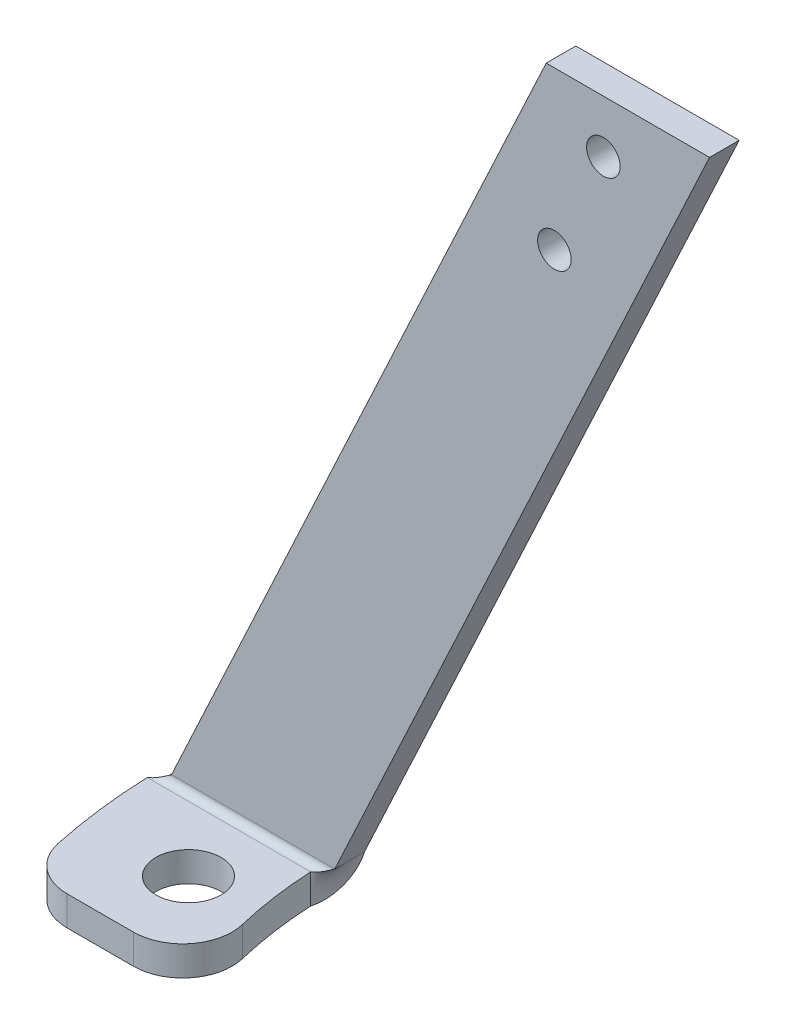
ISO-10303-21;
HEADER;
FILE_DESCRIPTION(('STEP AP214'),'2;1');
FILE_NAME('part.step','',(''),(''),'','','');
FILE_SCHEMA(('AUTOMOTIVE_DESIGN { 1 0 10303 214 1 1 1 1 }'));
ENDSEC;
DATA;
#1=APPLICATION_CONTEXT('core data for automotive mechanical design processes');
#2=APPLICATION_PROTOCOL_DEFINITION('international standard','automotive_design',2000,#1);
#3=PRODUCT_CONTEXT('',#1,'mechanical');
#4=PRODUCT('Part','Part','',(#3));
#5=PRODUCT_RELATED_PRODUCT_CATEGORY('part','',(#4));
#6=PRODUCT_DEFINITION_FORMATION('','',#4);
#7=PRODUCT_DEFINITION_CONTEXT('part definition',#1,'design');
#8=PRODUCT_DEFINITION('design','',#6,#7);
#9=PRODUCT_DEFINITION_SHAPE('','',#8);
#10=(LENGTH_UNIT() NAMED_UNIT(*) SI_UNIT(.MILLI.,.METRE.));
#11=(NAMED_UNIT(*) PLANE_ANGLE_UNIT() SI_UNIT($,.RADIAN.));
#12=(NAMED_UNIT(*) SI_UNIT($,.STERADIAN.) SOLID_ANGLE_UNIT());
#13=UNCERTAINTY_MEASURE_WITH_UNIT(LENGTH_MEASURE(1.E-05),#10,'distance_accuracy_value','');
#14=(GEOMETRIC_REPRESENTATION_CONTEXT(3) GLOBAL_UNCERTAINTY_ASSIGNED_CONTEXT((#13)) GLOBAL_UNIT_ASSIGNED_CONTEXT((#10,
#11,#12)) REPRESENTATION_CONTEXT('',''));
#15=CARTESIAN_POINT('',(0.,0.,0.));
#16=DIRECTION('',(0.,0.,1.));
#17=DIRECTION('',(1.,0.,0.));
#18=AXIS2_PLACEMENT_3D('',#15,#16,#17);
#19=CARTESIAN_POINT('',(0.,0.,1.5));
#20=DIRECTION('',(0.,0.,-1.));
#21=DIRECTION('',(-1.,0.,0.));
#22=AXIS2_PLACEMENT_3D('',#19,#20,#21);
#23=PLANE('',#22);
#24=DIRECTION('',(1.,0.,0.));
#25=VECTOR('',#24,1.);
#26=CARTESIAN_POINT('',(-42.4069260201008,3.7366,1.5));
#27=LINE('',#26,#25);
#28=CARTESIAN_POINT('',(-42.4069260201008,3.7366,1.5));
#29=VERTEX_POINT('',#28);
#30=CARTESIAN_POINT('',(-58.9575948045381,3.73659999999999,1.5));
#31=VERTEX_POINT('',#30);
#32=EDGE_CURVE('E185',#29,#31,#27,.F.);
#33=ORIENTED_EDGE('',*,*,#32,.F.);
#34=DIRECTION('',(0.422618261740693,0.906307787036653,0.));
#35=VECTOR('',#34,1.);
#36=CARTESIAN_POINT('',(-44.1493312155627,0.,1.5));
#37=LINE('',#36,#35);
#38=CARTESIAN_POINT('',(-4.43317583253724,85.1715700749326,1.5));
#39=VERTEX_POINT('',#38);
#40=EDGE_CURVE('E192',#29,#39,#37,.T.);
#41=ORIENTED_EDGE('',*,*,#40,.T.);
#42=DIRECTION('',(-1.,0.,0.));
#43=VECTOR('',#42,1.);
#44=CARTESIAN_POINT('',(-20.9838446169746,85.1715700749326,1.5));
#45=LINE('',#44,#43);
#46=CARTESIAN_POINT('',(-20.9838446169746,85.1715700749326,1.5));
#47=VERTEX_POINT('',#46);
#48=EDGE_CURVE('E301',#39,#47,#45,.T.);
#49=ORIENTED_EDGE('',*,*,#48,.T.);
#50=DIRECTION('',(-0.422618261740693,-0.906307787036653,0.));
#51=VECTOR('',#50,1.);
#52=CARTESIAN_POINT('',(-60.7,0.,1.5));
#53=LINE('',#52,#51);
#54=EDGE_CURVE('E298',#47,#31,#53,.T.);
#55=ORIENTED_EDGE('',*,*,#54,.T.);
#56=EDGE_LOOP('',(#33,#41,#49,#55));
#57=FACE_BOUND('',#56,.T.);
#58=CARTESIAN_POINT('',(-15.1911080308203,79.8476218989855,1.5));
#59=DIRECTION('',(0.,0.,1.));
#60=DIRECTION('',(1.,0.,0.));
#61=AXIS2_PLACEMENT_3D('',#58,#59,#60);
#62=CIRCLE('',#61,1.69999999999999);
#63=CARTESIAN_POINT('',(-13.4911080308203,79.8476218989855,1.5));
#64=VERTEX_POINT('',#63);
#65=EDGE_CURVE('E532',#64,#64,#62,.T.);
#66=ORIENTED_EDGE('',*,*,#65,.F.);
#67=EDGE_LOOP('',(#66));
#68=FACE_BOUND('',#67,.T.);
#69=CARTESIAN_POINT('',(-20.1563036429491,69.1997255470914,1.5));
#70=DIRECTION('',(0.,0.,1.));
#71=DIRECTION('',(1.,0.,0.));
#72=AXIS2_PLACEMENT_3D('',#69,#70,#71);
#73=CIRCLE('',#72,1.69999999999999);
#74=CARTESIAN_POINT('',(-18.4563036429491,69.1997255470914,1.5));
#75=VERTEX_POINT('',#74);
#76=EDGE_CURVE('E528',#75,#75,#73,.T.);
#77=ORIENTED_EDGE('',*,*,#76,.F.);
#78=EDGE_LOOP('',(#77));
#79=FACE_BOUND('',#78,.T.);
#80=ADVANCED_FACE('F60',(#57,#68,#79),#23,.F.);
#81=CARTESIAN_POINT('',(0.,3.00000000000001,0.));
#82=DIRECTION('',(0.,-1.,0.));
#83=DIRECTION('',(0.,0.,-1.));
#84=AXIS2_PLACEMENT_3D('',#81,#82,#83);
#85=PLANE('',#84);
#86=DIRECTION('',(-1.,0.,0.));
#87=VECTOR('',#86,1.);
#88=CARTESIAN_POINT('',(-58.4336375728912,2.99999999999995,16.5));
#89=LINE('',#88,#87);
#90=CARTESIAN_POINT('',(-47.8112068707751,2.99999999999995,16.5));
#91=VERTEX_POINT('',#90);
#92=CARTESIAN_POINT('',(-54.5188471132671,2.99999999999995,16.5));
#93=VERTEX_POINT('',#92);
#94=EDGE_CURVE('E171',#91,#93,#89,.T.);
#95=ORIENTED_EDGE('',*,*,#94,.F.);
#96=CARTESIAN_POINT('',(-47.8112068707751,2.99999999999996,11.5));
#97=DIRECTION('',(0.,-1.,0.));
#98=DIRECTION('',(0.,0.,-1.));
#99=AXIS2_PLACEMENT_3D('',#96,#97,#98);
#100=CIRCLE('',#99,5.);
#101=CARTESIAN_POINT('',(-42.9498549731308,2.99999999999997,10.3307020365746));
#102=VERTEX_POINT('',#101);
#103=EDGE_CURVE('E285',#91,#102,#100,.F.);
#104=ORIENTED_EDGE('',*,*,#103,.T.);
#105=CARTESIAN_POINT('',(0.,3.00000000000001,0.));
#106=DIRECTION('',(0.,-1.,0.));
#107=DIRECTION('',(0.,0.,-1.));
#108=AXIS2_PLACEMENT_3D('',#105,#106,#107);
#109=CIRCLE('',#108,44.1748055658591);
#110=CARTESIAN_POINT('',(-44.1181489550668,3.,2.2366));
#111=VERTEX_POINT('',#110);
#112=EDGE_CURVE('E177',#111,#102,#109,.F.);
#113=ORIENTED_EDGE('',*,*,#112,.F.);
#114=DIRECTION('',(-1.,0.,0.));
#115=VECTOR('',#114,1.);
#116=CARTESIAN_POINT('',(-60.6773237745371,3.,2.2366));
#117=LINE('',#116,#115);
#118=CARTESIAN_POINT('',(-60.6773237745371,3.,2.2366));
#119=VERTEX_POINT('',#118);
#120=EDGE_CURVE('E159',#119,#111,#117,.F.);
#121=ORIENTED_EDGE('',*,*,#120,.F.);
#122=CARTESIAN_POINT('',(0.,3.00000000000001,0.));
#123=DIRECTION('',(0.,-1.,0.));
#124=DIRECTION('',(0.,0.,-1.));
#125=AXIS2_PLACEMENT_3D('',#122,#123,#124);
#126=CIRCLE('',#125,60.7185309440207);
#127=CARTESIAN_POINT('',(-59.4111913827204,2.99999999999996,12.5319726494184));
#128=VERTEX_POINT('',#127);
#129=EDGE_CURVE('E165',#128,#119,#126,.T.);
#130=ORIENTED_EDGE('',*,*,#129,.F.);
#131=CARTESIAN_POINT('',(-54.5188471132671,2.99999999999996,11.5));
#132=DIRECTION('',(0.,-1.,0.));
#133=DIRECTION('',(0.,0.,-1.));
#134=AXIS2_PLACEMENT_3D('',#131,#132,#133);
#135=CIRCLE('',#134,5.);
#136=EDGE_CURVE('E287',#128,#93,#135,.F.);
#137=ORIENTED_EDGE('',*,*,#136,.T.);
#138=EDGE_LOOP('',(#95,#104,#113,#121,#130,#137));
#139=FACE_BOUND('',#138,.T.);
#140=CARTESIAN_POINT('',(-49.9297530777189,2.99999999999997,8.80396260771343));
#141=DIRECTION('',(0.,1.,0.));
#142=DIRECTION('',(0.,0.,1.));
#143=AXIS2_PLACEMENT_3D('',#140,#141,#142);
#144=CIRCLE('',#143,3.29999999999999);
#145=CARTESIAN_POINT('',(-49.9297530777189,2.99999999999996,12.1039626077134));
#146=VERTEX_POINT('',#145);
#147=EDGE_CURVE('E541',#146,#146,#144,.T.);
#148=ORIENTED_EDGE('',*,*,#147,.F.);
#149=EDGE_LOOP('',(#148));
#150=FACE_BOUND('',#149,.T.);
#151=ADVANCED_FACE('F254',(#139,#150),#85,.F.);
#152=CARTESIAN_POINT('',(-60.7,0.,-1.5));
#153=DIRECTION('',(-0.906307787036653,0.422618261740693,0.));
#154=DIRECTION('',(-0.422618261740693,-0.906307787036653,0.));
#155=AXIS2_PLACEMENT_3D('',#152,#153,#154);
#156=PLANE('',#155);
#157=DIRECTION('',(-0.422618261740693,-0.906307787036653,0.));
#158=VECTOR('',#157,1.);
#159=CARTESIAN_POINT('',(-60.7,0.,-1.5));
#160=LINE('',#159,#158);
#161=CARTESIAN_POINT('',(-20.9838446169746,85.1715700749326,-1.5));
#162=VERTEX_POINT('',#161);
#163=CARTESIAN_POINT('',(-58.9575948045381,3.73660000000001,-1.5));
#164=VERTEX_POINT('',#163);
#165=EDGE_CURVE('E296',#162,#164,#160,.T.);
#166=ORIENTED_EDGE('',*,*,#165,.T.);
#167=DIRECTION('',(0.,0.,-1.));
#168=VECTOR('',#167,1.);
#169=CARTESIAN_POINT('',(-58.9575948045381,3.73659999999999,1.5));
#170=LINE('',#169,#168);
#171=EDGE_CURVE('E189',#31,#164,#170,.T.);
#172=ORIENTED_EDGE('',*,*,#171,.F.);
#173=ORIENTED_EDGE('',*,*,#54,.F.);
#174=DIRECTION('',(0.,0.,1.));
#175=VECTOR('',#174,1.);
#176=CARTESIAN_POINT('',(-20.9838446169746,85.1715700749326,-1.5));
#177=LINE('',#176,#175);
#178=EDGE_CURVE('E292',#162,#47,#177,.T.);
#179=ORIENTED_EDGE('',*,*,#178,.F.);
#180=EDGE_LOOP('',(#166,#172,#173,#179));
#181=FACE_BOUND('',#180,.T.);
#182=ADVANCED_FACE('F256',(#181),#156,.T.);
#183=CARTESIAN_POINT('',(-44.1493312155627,0.,-1.5));
#184=DIRECTION('',(0.906307787036653,-0.422618261740693,0.));
#185=DIRECTION('',(0.422618261740693,0.906307787036653,0.));
#186=AXIS2_PLACEMENT_3D('',#183,#184,#185);
#187=PLANE('',#186);
#188=ORIENTED_EDGE('',*,*,#40,.F.);
#189=DIRECTION('',(0.,0.,-1.));
#190=VECTOR('',#189,1.);
#191=CARTESIAN_POINT('',(-42.4069260201008,3.7366,1.5));
#192=LINE('',#191,#190);
#193=CARTESIAN_POINT('',(-42.4069260201008,3.73659999999999,-1.5));
#194=VERTEX_POINT('',#193);
#195=EDGE_CURVE('E193',#29,#194,#192,.T.);
#196=ORIENTED_EDGE('',*,*,#195,.T.);
#197=DIRECTION('',(0.422618261740693,0.906307787036653,0.));
#198=VECTOR('',#197,1.);
#199=CARTESIAN_POINT('',(-44.1493312155627,0.,-1.5));
#200=LINE('',#199,#198);
#201=CARTESIAN_POINT('',(-4.43317583253724,85.1715700749326,-1.5));
#202=VERTEX_POINT('',#201);
#203=EDGE_CURVE('E233',#194,#202,#200,.T.);
#204=ORIENTED_EDGE('',*,*,#203,.T.);
#205=DIRECTION('',(0.,0.,1.));
#206=VECTOR('',#205,1.);
#207=CARTESIAN_POINT('',(-4.43317583253724,85.1715700749326,-1.5));
#208=LINE('',#207,#206);
#209=EDGE_CURVE('E293',#202,#39,#208,.T.);
#210=ORIENTED_EDGE('',*,*,#209,.T.);
#211=EDGE_LOOP('',(#188,#196,#204,#210));
#212=FACE_BOUND('',#211,.T.);
#213=ADVANCED_FACE('F250',(#212),#187,.T.);
#214=CARTESIAN_POINT('',(0.,0.,-1.5));
#215=DIRECTION('',(0.,0.,-1.));
#216=DIRECTION('',(-1.,0.,0.));
#217=AXIS2_PLACEMENT_3D('',#214,#215,#216);
#218=PLANE('',#217);
#219=CARTESIAN_POINT('',(-20.1563036429491,69.1997255470914,-1.5));
#220=DIRECTION('',(0.,0.,-1.));
#221=DIRECTION('',(-1.,0.,0.));
#222=AXIS2_PLACEMENT_3D('',#219,#220,#221);
#223=CIRCLE('',#222,1.69999999999999);
#224=CARTESIAN_POINT('',(-21.8563036429491,69.1997255470914,-1.5));
#225=VERTEX_POINT('',#224);
#226=EDGE_CURVE('E531',#225,#225,#223,.T.);
#227=ORIENTED_EDGE('',*,*,#226,.F.);
#228=EDGE_LOOP('',(#227));
#229=FACE_BOUND('',#228,.T.);
#230=CARTESIAN_POINT('',(-15.1911080308203,79.8476218989855,-1.5));
#231=DIRECTION('',(0.,0.,-1.));
#232=DIRECTION('',(-1.,0.,0.));
#233=AXIS2_PLACEMENT_3D('',#230,#231,#232);
#234=CIRCLE('',#233,1.69999999999999);
#235=CARTESIAN_POINT('',(-16.8911080308203,79.8476218989855,-1.5));
#236=VERTEX_POINT('',#235);
#237=EDGE_CURVE('E535',#236,#236,#234,.T.);
#238=ORIENTED_EDGE('',*,*,#237,.F.);
#239=EDGE_LOOP('',(#238));
#240=FACE_BOUND('',#239,.T.);
#241=ORIENTED_EDGE('',*,*,#203,.F.);
#242=DIRECTION('',(1.,0.,0.));
#243=VECTOR('',#242,1.);
#244=CARTESIAN_POINT('',(-42.4069260201008,3.73659999999999,-1.5));
#245=LINE('',#244,#243);
#246=EDGE_CURVE('E147',#194,#164,#245,.F.);
#247=ORIENTED_EDGE('',*,*,#246,.T.);
#248=ORIENTED_EDGE('',*,*,#165,.F.);
#249=DIRECTION('',(-1.,0.,0.));
#250=VECTOR('',#249,1.);
#251=CARTESIAN_POINT('',(-20.9838446169746,85.1715700749326,-1.5));
#252=LINE('',#251,#250);
#253=EDGE_CURVE('E306',#202,#162,#252,.T.);
#254=ORIENTED_EDGE('',*,*,#253,.F.);
#255=EDGE_LOOP('',(#241,#247,#248,#254));
#256=FACE_BOUND('',#255,.T.);
#257=ADVANCED_FACE('F240',(#229,#240,#256),#218,.T.);
#258=CARTESIAN_POINT('',(-20.9838446169746,85.1715700749326,-1.5));
#259=DIRECTION('',(0.,1.,0.));
#260=DIRECTION('',(0.,0.,1.));
#261=AXIS2_PLACEMENT_3D('',#258,#259,#260);
#262=PLANE('',#261);
#263=ORIENTED_EDGE('',*,*,#48,.F.);
#264=ORIENTED_EDGE('',*,*,#209,.F.);
#265=ORIENTED_EDGE('',*,*,#253,.T.);
#266=ORIENTED_EDGE('',*,*,#178,.T.);
#267=EDGE_LOOP('',(#263,#264,#265,#266));
#268=FACE_BOUND('',#267,.T.);
#269=ADVANCED_FACE('F249',(#268),#262,.T.);
#270=CARTESIAN_POINT('',(-58.9575948045381,3.7366,-1.53));
#271=CARTESIAN_POINT('',(-59.1009295052151,3.24347124009852,-1.52999999999999));
#272=CARTESIAN_POINT('',(-59.2442162995379,2.75070041877234,-1.43196548393888));
#273=CARTESIAN_POINT('',(-59.5308377945378,1.83966874853498,-1.05460381037515));
#274=CARTESIAN_POINT('',(-59.6741485420377,1.42184832454248,-0.775425128576994));
#275=CARTESIAN_POINT('',(-59.9607700370375,0.724574871423021,-0.0781516754575178));
#276=CARTESIAN_POINT('',(-60.1040807845374,0.445396189624848,0.339668748534959));
#277=CARTESIAN_POINT('',(-60.3907022795373,0.0680345160611271,1.25070041877233));
#278=CARTESIAN_POINT('',(-60.5339890738601,-0.0300000000000078,1.74347124009848));
#279=CARTESIAN_POINT('',(-60.6773237745371,-0.0300000000000039,2.23659999999999));
#280=CARTESIAN_POINT('',(-58.9575948045381,3.7366,-1.5));
#281=CARTESIAN_POINT('',(-59.100929347774,3.24739898889228,-1.49999999999999));
#282=CARTESIAN_POINT('',(-59.2442162995379,2.75855285530311,-1.40274630363883));
#283=CARTESIAN_POINT('',(-59.5308377945378,1.8547773179461,-1.02839021872452));
#284=CARTESIAN_POINT('',(-59.6741485420377,1.44028472614173,-0.751435123305048));
#285=CARTESIAN_POINT('',(-59.9607700370375,0.748564876694966,-0.0597152738582704));
#286=CARTESIAN_POINT('',(-60.1040807845374,0.471609781275476,0.354777317946086));
#287=CARTESIAN_POINT('',(-60.3907022795373,0.0972536963611765,1.2585528553031));
#288=CARTESIAN_POINT('',(-60.5339892313012,0.,1.74739898889224));
#289=CARTESIAN_POINT('',(-60.6773237745371,0.,2.23659999999999));
#290=CARTESIAN_POINT('',(-58.9575948045381,3.7366,1.5));
#291=CARTESIAN_POINT('',(-59.1009136036655,3.64017386826869,1.5));
#292=CARTESIAN_POINT('',(-59.2442162995379,3.54379650838095,1.51917172636612));
#293=CARTESIAN_POINT('',(-59.5308377945377,3.36563425905879,1.59296894633825));
#294=CARTESIAN_POINT('',(-59.6741485420376,3.28392488606647,1.6475654038895));
#295=CARTESIAN_POINT('',(-59.9607700370375,3.1475654038895,1.78392488606648));
#296=CARTESIAN_POINT('',(-60.1040807845374,3.09296894633825,1.86563425905879));
#297=CARTESIAN_POINT('',(-60.3907022795372,3.01917172636612,2.04379650838095));
#298=CARTESIAN_POINT('',(-60.5340049754096,3.,2.14017386826869));
#299=CARTESIAN_POINT('',(-60.6773237745371,3.,2.2366));
#300=CARTESIAN_POINT('',(-58.9575948045381,3.7366,1.5303));
#301=CARTESIAN_POINT('',(-59.10091344465,3.64414089455039,1.5303));
#302=CARTESIAN_POINT('',(-59.2442162995379,3.55172746927704,1.54868309846917));
#303=CARTESIAN_POINT('',(-59.5308377945377,3.38089391416403,1.61944467390539));
#304=CARTESIAN_POINT('',(-59.6741485420376,3.30254565168171,1.67179530921417));
#305=CARTESIAN_POINT('',(-59.9607700370375,3.17179530921416,1.80254565168172));
#306=CARTESIAN_POINT('',(-60.1040807845374,3.11944467390538,1.88089391416403));
#307=CARTESIAN_POINT('',(-60.3907022795372,3.04868309846917,2.05172746927704));
#308=CARTESIAN_POINT('',(-60.5340051344251,3.0303,2.14414089455039));
#309=CARTESIAN_POINT('',(-60.6773237745371,3.0303,2.2366));
#310=B_SPLINE_SURFACE_WITH_KNOTS('',1,3,((#270,#271,#272,#273,#274,#275,#276,#277,#278,#279),
(#280,#281,#282,#283,#284,#285,#286,#287,#288,#289),(#290,#291,#292,#293,#294,#295,#296,#297,
#298,#299),(#300,#301,#302,#303,#304,#305,#306,#307,#308,#309)),.UNSPECIFIED.,.F.,.F.,.F.,(2,1,
1,2),(4,2,2,2,4),(-0.01,0.,1.,1.0101),(0.,0.25,0.5,0.75,1.),.UNSPECIFIED.);
#311=DIRECTION('',(0.,1.,0.));
#312=VECTOR('',#311,1.);
#313=CARTESIAN_POINT('',(-60.6773237745371,0.,2.23659999999999));
#314=LINE('',#313,#312);
#315=CARTESIAN_POINT('',(-60.6773237745371,0.,2.23659999999999));
#316=VERTEX_POINT('',#315);
#317=EDGE_CURVE('E181',#119,#316,#314,.F.);
#318=CARTESIAN_POINT('',(-58.9575948045381,3.7366,1.5));
#319=CARTESIAN_POINT('',(-59.009441416283,3.70171808094785,1.49998178728871));
#320=CARTESIAN_POINT('',(-59.061286182421,3.66683800927958,1.50247678780384));
#321=CARTESIAN_POINT('',(-59.1649668802592,3.59778243087087,1.51236358218766));
#322=CARTESIAN_POINT('',(-59.216802812089,3.56360681631167,1.51975462088169));
#323=CARTESIAN_POINT('',(-59.320361904387,3.49672396643255,1.53928228857175));
#324=CARTESIAN_POINT('',(-59.372085060408,3.46401364725954,1.55140837321062));
#325=CARTESIAN_POINT('',(-59.4755300108116,3.40063245124106,1.58015814888006));
#326=CARTESIAN_POINT('',(-59.5272518051819,3.3699615890546,1.59678187223394));
#327=CARTESIAN_POINT('',(-59.6344763180211,3.3091300704809,1.63556495461674));
#328=CARTESIAN_POINT('',(-59.6899792437555,3.27917033524923,1.65803997117576));
#329=CARTESIAN_POINT('',(-59.8009875457508,3.22300350112085,1.7072672408719));
#330=CARTESIAN_POINT('',(-59.8564929220309,3.1967965296728,1.73401963920911));
#331=CARTESIAN_POINT('',(-59.9674607278976,3.1487545188089,1.79116871319322));
#332=CARTESIAN_POINT('',(-60.0229231576694,3.1269161311342,1.82156256908934));
#333=CARTESIAN_POINT('',(-60.1338272787511,3.0880987908858,1.88528989298515));
#334=CARTESIAN_POINT('',(-60.189268971636,3.0711185379418,1.91862257122347));
#335=CARTESIAN_POINT('',(-60.3167995879024,3.03809612325881,1.99781439212819));
#336=CARTESIAN_POINT('',(-60.388898160156,3.02386010656592,2.044433885154));
#337=CARTESIAN_POINT('',(-60.4970228007642,3.00957214348836,2.11576553112028));
#338=CARTESIAN_POINT('',(-60.5330758900401,3.00598714649084,2.13978705328305));
#339=CARTESIAN_POINT('',(-60.6051906911462,3.00119992563898,2.18807081448111));
#340=CARTESIAN_POINT('',(-60.6412524031151,2.99999823048486,2.21233310572806));
#341=CARTESIAN_POINT('',(-60.6773237745371,3.,2.2366));
#342=B_SPLINE_CURVE_WITH_KNOTS('',3,(#318,#319,#320,#321,#322,#323,#324,#325,#326,#327,#328,
#329,#330,#331,#332,#333,#334,#335,#336,#337,#338,#339,#340,#341),.UNSPECIFIED.,.F.,.F.,(4,2,2,
2,2,2,2,2,2,2,2,4),(0.,0.187412218968422,0.374795537832105,0.561763935484441,0.748733676863889,
0.949360869451709,1.14999487398071,1.35047451032402,1.55090043424424,1.81139096513568,
1.94174776460387,2.07213347856469),.UNSPECIFIED.);
#343=EDGE_CURVE('E150',#31,#119,#342,.T.);
#344=CARTESIAN_POINT('',(-58.9575948045381,3.7366,-1.5));
#345=CARTESIAN_POINT('',(-58.9939605264405,3.61249069301924,-1.50002220762891));
#346=CARTESIAN_POINT('',(-59.0303246542398,3.48838393042922,-1.49381769923603));
#347=CARTESIAN_POINT('',(-59.1030524267076,3.24139434020056,-1.46911317433862));
#348=CARTESIAN_POINT('',(-59.139416071305,3.11851155925721,-1.45061269054855));
#349=CARTESIAN_POINT('',(-59.212064475114,2.87546050208484,-1.40152709460464));
#350=CARTESIAN_POINT('',(-59.2483492354919,2.75528694795374,-1.37096810414507));
#351=CARTESIAN_POINT('',(-59.3209170798145,2.51858169178077,-1.29807662771736));
#352=CARTESIAN_POINT('',(-59.3572001631168,2.40204941678907,-1.25574600448085));
#353=CARTESIAN_POINT('',(-59.4255707522718,2.18696025340783,-1.16528112534507));
#354=CARTESIAN_POINT('',(-59.4576588407095,2.0878817373976,-1.11838182016078));
#355=CARTESIAN_POINT('',(-59.5218443406536,1.89419058689468,-1.01604602891415));
#356=CARTESIAN_POINT('',(-59.553941751865,1.79957938864511,-0.960606821362356));
#357=CARTESIAN_POINT('',(-59.6181088620557,1.61566913530125,-0.841681053298666));
#358=CARTESIAN_POINT('',(-59.6501785621134,1.52636577481052,-0.778201149498021));
#359=CARTESIAN_POINT('',(-59.7143321236917,1.35364583526458,-0.643625454001263));
#360=CARTESIAN_POINT('',(-59.7464159862811,1.27023129762094,-0.572527042579835));
#361=CARTESIAN_POINT('',(-59.810574588333,1.10998823879921,-0.423301046436292));
#362=CARTESIAN_POINT('',(-59.8426493279332,1.03315795618362,-0.345175353206541));
#363=CARTESIAN_POINT('',(-59.9067988582251,0.886651459053779,-0.182481698646705));
#364=CARTESIAN_POINT('',(-59.9388736489169,0.816975244424482,-0.0979137374202244));
#365=CARTESIAN_POINT('',(-60.0030428142166,0.685268310163834,0.0770735314692499));
#366=CARTESIAN_POINT('',(-60.0351371868544,0.623242964925481,0.167496885051315));
#367=CARTESIAN_POINT('',(-60.0993167103744,0.507395042444284,0.353409399768144));
#368=CARTESIAN_POINT('',(-60.1314018605836,0.45356962098943,0.448896788836159));
#369=CARTESIAN_POINT('',(-60.1956009929619,0.354468311969344,0.6443131417673));
#370=CARTESIAN_POINT('',(-60.2277149760495,0.309199864652832,0.744245878436657));
#371=CARTESIAN_POINT('',(-60.2919314596654,0.227635700913525,0.947665449975193));
#372=CARTESIAN_POINT('',(-60.3240339599932,0.191336632805557,1.05115094073392));
#373=CARTESIAN_POINT('',(-60.3882002541734,0.128005057529377,1.2607925873532));
#374=CARTESIAN_POINT('',(-60.4202640515099,0.100962329931913,1.36694565781556));
#375=CARTESIAN_POINT('',(-60.4843786573045,0.0563065478405389,1.58117399672736));
#376=CARTESIAN_POINT('',(-60.5164294647105,0.0386890271258794,1.68924832963885));
#377=CARTESIAN_POINT('',(-60.5699698410693,0.0172325724939576,1.87071868064817));
#378=CARTESIAN_POINT('',(-60.5914614321266,0.0107667152048574,1.94381397636218));
#379=CARTESIAN_POINT('',(-60.6344093121025,0.00215321899631623,2.09013713409056));
#380=CARTESIAN_POINT('',(-60.655865600622,-1.54382245978864E-06,2.16336457693721));
#381=CARTESIAN_POINT('',(-60.6773237745371,0.,2.23659999999999));
#382=B_SPLINE_CURVE_WITH_KNOTS('',3,(#344,#345,#346,#347,#348,#349,#350,#351,#352,#353,#354,
#355,#356,#357,#358,#359,#360,#361,#362,#363,#364,#365,#366,#367,#368,#369,#370,#371,#372,#373,
#374,#375,#376,#377,#378,#379,#380,#381),.UNSPECIFIED.,.F.,.F.,(4,2,2,2,2,2,2,2,2,2,2,2,2,2,2,2,
2,2,4),(0.,0.387829906197559,0.775674551988107,1.1626836028898,1.54963144867197,
1.89188855545937,2.23425495898536,2.57633975527136,2.9185425617625,3.26065353358921,
3.60276449991411,3.94511443161324,4.28734534468174,4.6298724707636,4.97227140679381,
5.31429105266434,5.65614848551466,5.88542408049237,6.11432049339392),.UNSPECIFIED.);
#383=EDGE_CURVE('E188',#164,#316,#382,.T.);
#384=ORIENTED_EDGE('',*,*,#317,.F.);
#385=ORIENTED_EDGE('',*,*,#343,.F.);
#386=ORIENTED_EDGE('',*,*,#171,.T.);
#387=ORIENTED_EDGE('',*,*,#383,.T.);
#388=EDGE_LOOP('',(#384,#385,#386,#387));
#389=FACE_BOUND('',#388,.T.);
#390=ADVANCED_FACE('F207',(#389),#310,.F.);
#391=CARTESIAN_POINT('',(-44.1181489550668,-0.0299999999999991,2.23659999999999));
#392=CARTESIAN_POINT('',(-43.9755231909947,-0.0299999999999983,1.74347117642536));
#393=CARTESIAN_POINT('',(-43.8329451325724,0.0680345160611262,1.25070041877233));
#394=CARTESIAN_POINT('',(-43.5477413100781,0.445396189624855,0.339668748534967));
#395=CARTESIAN_POINT('',(-43.4051393988309,0.724574871423016,-0.0781516754575151));
#396=CARTESIAN_POINT('',(-43.1199355763366,1.42184832454248,-0.775425128576984));
#397=CARTESIAN_POINT('',(-42.9773336650894,1.83966874853497,-1.05460381037515));
#398=CARTESIAN_POINT('',(-42.6921298425951,2.75070041877233,-1.43196548393888));
#399=CARTESIAN_POINT('',(-42.5495517841728,3.24347117642536,-1.53));
#400=CARTESIAN_POINT('',(-42.4069260201007,3.73659999999999,-1.53));
#401=CARTESIAN_POINT('',(-44.1181489550668,0.,2.23659999999999));
#402=CARTESIAN_POINT('',(-43.9755233472939,0.,1.74739892548271));
#403=CARTESIAN_POINT('',(-43.8329451325724,0.0972536963611757,1.25855285530311));
#404=CARTESIAN_POINT('',(-43.5477413100781,0.471609781275483,0.354777317946094));
#405=CARTESIAN_POINT('',(-43.4051393988309,0.748564876694961,-0.0597152738582676));
#406=CARTESIAN_POINT('',(-43.1199355763366,1.44028472614173,-0.751435123305038));
#407=CARTESIAN_POINT('',(-42.9773336650894,1.85477731794609,-1.02839021872452));
#408=CARTESIAN_POINT('',(-42.6921298425951,2.75855285530311,-1.40274630363883));
#409=CARTESIAN_POINT('',(-42.5495516278736,3.24739892548272,-1.5));
#410=CARTESIAN_POINT('',(-42.4069260201007,3.73659999999999,-1.5));
#411=CARTESIAN_POINT('',(-44.1181489550668,3.,2.2366));
#412=CARTESIAN_POINT('',(-43.9755389772211,3.,2.14017383121858));
#413=CARTESIAN_POINT('',(-43.8329451325724,3.01917172636612,2.04379650838095));
#414=CARTESIAN_POINT('',(-43.5477413100781,3.09296894633825,1.86563425905879));
#415=CARTESIAN_POINT('',(-43.4051393988309,3.1475654038895,1.78392488606648));
#416=CARTESIAN_POINT('',(-43.1199355763366,3.28392488606648,1.6475654038895));
#417=CARTESIAN_POINT('',(-42.9773336650894,3.3656342590588,1.59296894633825));
#418=CARTESIAN_POINT('',(-42.6921298425951,3.54379650838095,1.51917172636612));
#419=CARTESIAN_POINT('',(-42.5495359979464,3.64017383121857,1.5));
#420=CARTESIAN_POINT('',(-42.4069260201007,3.7366,1.5));
#421=CARTESIAN_POINT('',(-44.1181489550668,3.0303,2.2366));
#422=CARTESIAN_POINT('',(-43.9755391350834,3.0303,2.14414085776651));
#423=CARTESIAN_POINT('',(-43.8329451325724,3.04868309846917,2.05172746927704));
#424=CARTESIAN_POINT('',(-43.5477413100781,3.11944467390539,1.88089391416403));
#425=CARTESIAN_POINT('',(-43.4051393988309,3.17179530921417,1.80254565168172));
#426=CARTESIAN_POINT('',(-43.1199355763366,3.30254565168172,1.67179530921417));
#427=CARTESIAN_POINT('',(-42.9773336650894,3.38089391416403,1.61944467390539));
#428=CARTESIAN_POINT('',(-42.6921298425951,3.55172746927704,1.54868309846917));
#429=CARTESIAN_POINT('',(-42.5495358400841,3.6441408577665,1.5303));
#430=CARTESIAN_POINT('',(-42.4069260201007,3.7366,1.5303));
#431=B_SPLINE_SURFACE_WITH_KNOTS('',1,3,((#391,#392,#393,#394,#395,#396,#397,#398,#399,#400),
(#401,#402,#403,#404,#405,#406,#407,#408,#409,#410),(#411,#412,#413,#414,#415,#416,#417,#418,
#419,#420),(#421,#422,#423,#424,#425,#426,#427,#428,#429,#430)),.UNSPECIFIED.,.F.,.F.,.F.,(2,1,
1,2),(4,2,2,2,4),(-0.01,0.,1.,1.0101),(0.,0.25,0.5,0.75,1.),.UNSPECIFIED.);
#432=CARTESIAN_POINT('',(-44.1181489550668,3.,2.2366));
#433=CARTESIAN_POINT('',(-44.0663686808383,2.9999815162354,2.2015894987457));
#434=CARTESIAN_POINT('',(-44.0145902504112,3.00249506960214,2.1665809205589));
#435=CARTESIAN_POINT('',(-43.9110421057552,3.01245470099298,2.09727603154893));
#436=CARTESIAN_POINT('',(-43.8592723913989,3.01990002845365,2.06297961316164));
#437=CARTESIAN_POINT('',(-43.7558491427287,3.03956925478082,1.99587307155212));
#438=CARTESIAN_POINT('',(-43.7041956129999,3.05178220553482,1.96305973392146));
#439=CARTESIAN_POINT('',(-43.6008901916496,3.08073515466881,1.89949446085823));
#440=CARTESIAN_POINT('',(-43.5492383000304,3.09747515934176,1.86874252829126));
#441=CARTESIAN_POINT('',(-43.4425441490948,3.1363841531621,1.80799145871755));
#442=CARTESIAN_POINT('',(-43.3875017208509,3.1588372096269,1.77817398872856));
#443=CARTESIAN_POINT('',(-43.2774145086772,3.20798592325492,1.72227297583453));
#444=CARTESIAN_POINT('',(-43.2223697247279,3.23468171401353,1.69618955055641));
#445=CARTESIAN_POINT('',(-43.112323345976,3.29168810968968,1.64836929340022));
#446=CARTESIAN_POINT('',(-43.0573217509711,3.32199587915277,1.62662908745156));
#447=CARTESIAN_POINT('',(-42.9473390515077,3.38552852711703,1.58797680621203));
#448=CARTESIAN_POINT('',(-42.8923579454876,3.41875262843798,1.57106344967952));
#449=CARTESIAN_POINT('',(-42.7656490373641,3.49782599075486,1.53809239996482));
#450=CARTESIAN_POINT('',(-42.6939114077432,3.54444284621533,1.52385791603329));
#451=CARTESIAN_POINT('',(-42.5863276444635,3.61577057826629,1.50957133111658));
#452=CARTESIAN_POINT('',(-42.5504544034246,3.63979109997433,1.50598663946319));
#453=CARTESIAN_POINT('',(-42.4786993450584,3.68807282841161,1.50119983182371));
#454=CARTESIAN_POINT('',(-42.4428175275922,3.71233408729762,1.49999824399798));
#455=CARTESIAN_POINT('',(-42.4069260201007,3.7366,1.5));
#456=B_SPLINE_CURVE_WITH_KNOTS('',3,(#432,#433,#434,#435,#436,#437,#438,#439,#440,#441,#442,
#443,#444,#445,#446,#447,#448,#449,#450,#451,#452,#453,#454,#455),.UNSPECIFIED.,.F.,.F.,(4,2,2,
2,2,2,2,2,2,2,2,4),(0.,0.18746214231974,0.374895761452807,0.561901476322012,0.748907451145298,
0.948178947204719,1.14745671917685,1.34657907314294,1.54564852269349,1.80523549299724,
1.93514325730948,2.06507980948559),.UNSPECIFIED.);
#457=EDGE_CURVE('E157',#111,#29,#456,.T.);
#458=DIRECTION('',(0.,1.,0.));
#459=VECTOR('',#458,1.);
#460=CARTESIAN_POINT('',(-44.1181489550668,0.,2.23659999999999));
#461=LINE('',#460,#459);
#462=CARTESIAN_POINT('',(-44.1181489550668,0.,2.23659999999999));
#463=VERTEX_POINT('',#462);
#464=EDGE_CURVE('E154',#111,#463,#461,.F.);
#465=CARTESIAN_POINT('',(-44.1181489550668,0.,2.23659999999999));
#466=CARTESIAN_POINT('',(-44.0819473326995,-2.22476907537245E-05,2.11243660915119));
#467=CARTESIAN_POINT('',(-44.0457473012589,0.00618768856684918,1.9882757687276));
#468=CARTESIAN_POINT('',(-43.9733476948937,0.0309137329423491,1.74117953883764));
#469=CARTESIAN_POINT('',(-43.9371481200411,0.049430317832295,1.61824419703562));
#470=CARTESIAN_POINT('',(-43.8648278720014,0.0985582060609517,1.37509260218312));
#471=CARTESIAN_POINT('',(-43.8287071976549,0.129143239542536,1.25487103889027));
#472=CARTESIAN_POINT('',(-43.7564675516749,0.202096354050582,1.01807447687255));
#473=CARTESIAN_POINT('',(-43.7203485806864,0.244462557594142,0.901498900402541));
#474=CARTESIAN_POINT('',(-43.6523133518668,0.334968057822394,0.686416369448687));
#475=CARTESIAN_POINT('',(-43.6203965065318,0.38186419999529,0.587384054123942));
#476=CARTESIAN_POINT('',(-43.5565535541249,0.484186347294238,0.393782963571779));
#477=CARTESIAN_POINT('',(-43.5246274473463,0.539615068658805,0.29921562228299));
#478=CARTESIAN_POINT('',(-43.4608028212582,0.658512921564421,0.115389852621033));
#479=CARTESIAN_POINT('',(-43.4289043008785,0.721975395139198,0.0261271170598713));
#480=CARTESIAN_POINT('',(-43.3650931731094,0.856509847076511,-0.146515710486828));
#481=CARTESIAN_POINT('',(-43.3331805646564,0.92758444284734,-0.229893762585082));
#482=CARTESIAN_POINT('',(-43.2693643936557,1.07675711679539,-0.390068869825055));
#483=CARTESIAN_POINT('',(-43.237460830971,1.1548533117869,-0.466867678786265));
#484=CARTESIAN_POINT('',(-43.1736536535838,1.31748291785837,-0.613316855923503));
#485=CARTESIAN_POINT('',(-43.1417500388813,1.40201632883232,-0.682967224217246));
#486=CARTESIAN_POINT('',(-43.0779233474186,1.57693014851887,-0.814628662417517));
#487=CARTESIAN_POINT('',(-43.0460002726177,1.66731459732649,-0.876634366057724));
#488=CARTESIAN_POINT('',(-42.9821632989045,1.85314588620867,-0.992449808937096));
#489=CARTESIAN_POINT('',(-42.9502494006604,1.94859095540576,-1.04626239003029));
#490=CARTESIAN_POINT('',(-42.8863929560942,2.14391999408858,-1.14534516854962));
#491=CARTESIAN_POINT('',(-42.8544504088541,2.24380772919556,-1.19060794182988));
#492=CARTESIAN_POINT('',(-42.7905767382871,2.44713573139099,-1.27216832621402));
#493=CARTESIAN_POINT('',(-42.7586456151583,2.55057465505917,-1.30846928593067));
#494=CARTESIAN_POINT('',(-42.6948217825409,2.76012288391558,-1.37181247878748));
#495=CARTESIAN_POINT('',(-42.6629290696048,2.86622911103988,-1.39886490163312));
#496=CARTESIAN_POINT('',(-42.5991565688102,3.08036422712391,-1.44354787825642));
#497=CARTESIAN_POINT('',(-42.5672767819848,3.18839218160051,-1.46118288867978));
#498=CARTESIAN_POINT('',(-42.5139695198379,3.36996534066301,-1.48269623199525));
#499=CARTESIAN_POINT('',(-42.4925400553448,3.44321058477883,-1.48918879935239));
#500=CARTESIAN_POINT('',(-42.4497163588716,3.58983484188654,-1.49783788611944));
#501=CARTESIAN_POINT('',(-42.428322127295,3.66321343268645,-1.50000156601456));
#502=CARTESIAN_POINT('',(-42.4069260201007,3.73659999999999,-1.5));
#503=B_SPLINE_CURVE_WITH_KNOTS('',3,(#465,#466,#467,#468,#469,#470,#471,#472,#473,#474,#475,
#476,#477,#478,#479,#480,#481,#482,#483,#484,#485,#486,#487,#488,#489,#490,#491,#492,#493,#494,
#495,#496,#497,#498,#499,#500,#501,#502),.UNSPECIFIED.,.F.,.F.,(4,2,2,2,2,2,2,2,2,2,2,2,2,2,2,2,
2,2,4),(0.,0.387847271526148,0.775709569524837,1.16273220935439,1.54969320739665,
1.89168255024116,2.23378098705961,2.57559774370424,2.91753241279724,3.25937564737406,
3.6012188763216,3.94330071635463,4.28526363075295,4.62752213398867,4.96965255692509,
5.31140480881193,5.65299518805447,5.88265459892143,6.11193381119491),.UNSPECIFIED.);
#504=EDGE_CURVE('E140',#463,#194,#503,.T.);
#505=ORIENTED_EDGE('',*,*,#457,.F.);
#506=ORIENTED_EDGE('',*,*,#464,.T.);
#507=ORIENTED_EDGE('',*,*,#504,.T.);
#508=ORIENTED_EDGE('',*,*,#195,.F.);
#509=EDGE_LOOP('',(#505,#506,#507,#508));
#510=FACE_BOUND('',#509,.T.);
#511=ADVANCED_FACE('F155',(#510),#431,.F.);
#512=CARTESIAN_POINT('',(-42.4069260201008,3.7366,2.2366));
#513=DIRECTION('',(1.,0.,0.));
#514=DIRECTION('',(0.,-1.,0.));
#515=AXIS2_PLACEMENT_3D('',#512,#513,#514);
#516=CYLINDRICAL_SURFACE('',#515,3.7366);
#517=ORIENTED_EDGE('',*,*,#246,.F.);
#518=ORIENTED_EDGE('',*,*,#504,.F.);
#519=DIRECTION('',(1.,0.,0.));
#520=VECTOR('',#519,1.);
#521=CARTESIAN_POINT('',(0.,0.,2.23659999999999));
#522=LINE('',#521,#520);
#523=EDGE_CURVE('E144',#316,#463,#522,.T.);
#524=ORIENTED_EDGE('',*,*,#523,.F.);
#525=ORIENTED_EDGE('',*,*,#383,.F.);
#526=EDGE_LOOP('',(#517,#518,#524,#525));
#527=FACE_BOUND('',#526,.T.);
#528=ADVANCED_FACE('F142',(#527),#516,.T.);
#529=CARTESIAN_POINT('',(-42.4069260201008,3.7366,2.2366));
#530=DIRECTION('',(1.,0.,0.));
#531=DIRECTION('',(0.,-1.,0.));
#532=AXIS2_PLACEMENT_3D('',#529,#530,#531);
#533=CYLINDRICAL_SURFACE('',#532,0.736599999999998);
#534=ORIENTED_EDGE('',*,*,#32,.T.);
#535=ORIENTED_EDGE('',*,*,#343,.T.);
#536=ORIENTED_EDGE('',*,*,#120,.T.);
#537=ORIENTED_EDGE('',*,*,#457,.T.);
#538=EDGE_LOOP('',(#534,#535,#536,#537));
#539=FACE_BOUND('',#538,.T.);
#540=ADVANCED_FACE('F215',(#539),#533,.F.);
#541=CARTESIAN_POINT('',(0.,0.,0.));
#542=DIRECTION('',(0.,1.,0.));
#543=DIRECTION('',(0.,0.,1.));
#544=AXIS2_PLACEMENT_3D('',#541,#542,#543);
#545=CYLINDRICAL_SURFACE('',#544,60.7185309440207);
#546=CARTESIAN_POINT('',(0.,0.,0.));
#547=DIRECTION('',(0.,-1.,0.));
#548=DIRECTION('',(0.,0.,-1.));
#549=AXIS2_PLACEMENT_3D('',#546,#547,#548);
#550=CIRCLE('',#549,60.7185309440207);
#551=CARTESIAN_POINT('',(-59.4111913827204,0.,12.5319726494183));
#552=VERTEX_POINT('',#551);
#553=EDGE_CURVE('E164',#552,#316,#550,.T.);
#554=ORIENTED_EDGE('',*,*,#553,.F.);
#555=DIRECTION('',(0.,1.,0.));
#556=VECTOR('',#555,1.);
#557=CARTESIAN_POINT('',(-59.4111913827204,0.,12.5319726494183));
#558=LINE('',#557,#556);
#559=EDGE_CURVE('E13',#552,#128,#558,.T.);
#560=ORIENTED_EDGE('',*,*,#559,.T.);
#561=ORIENTED_EDGE('',*,*,#129,.T.);
#562=ORIENTED_EDGE('',*,*,#317,.T.);
#563=EDGE_LOOP('',(#554,#560,#561,#562));
#564=FACE_BOUND('',#563,.T.);
#565=ADVANCED_FACE('F216',(#564),#545,.T.);
#566=CARTESIAN_POINT('',(0.,0.,0.));
#567=DIRECTION('',(0.,1.,0.));
#568=DIRECTION('',(0.,0.,1.));
#569=AXIS2_PLACEMENT_3D('',#566,#567,#568);
#570=CYLINDRICAL_SURFACE('',#569,44.1748055658591);
#571=ORIENTED_EDGE('',*,*,#112,.T.);
#572=DIRECTION('',(0.,1.,0.));
#573=VECTOR('',#572,1.);
#574=CARTESIAN_POINT('',(-42.9498549731308,0.,10.3307020365746));
#575=LINE('',#574,#573);
#576=CARTESIAN_POINT('',(-42.9498549731308,0.,10.3307020365746));
#577=VERTEX_POINT('',#576);
#578=EDGE_CURVE('E83',#102,#577,#575,.F.);
#579=ORIENTED_EDGE('',*,*,#578,.T.);
#580=CARTESIAN_POINT('',(0.,0.,0.));
#581=DIRECTION('',(0.,-1.,0.));
#582=DIRECTION('',(0.,0.,-1.));
#583=AXIS2_PLACEMENT_3D('',#580,#581,#582);
#584=CIRCLE('',#583,44.1748055658591);
#585=EDGE_CURVE('E162',#463,#577,#584,.F.);
#586=ORIENTED_EDGE('',*,*,#585,.F.);
#587=ORIENTED_EDGE('',*,*,#464,.F.);
#588=EDGE_LOOP('',(#571,#579,#586,#587));
#589=FACE_BOUND('',#588,.T.);
#590=ADVANCED_FACE('F167',(#589),#570,.F.);
#591=CARTESIAN_POINT('',(0.,0.,0.));
#592=DIRECTION('',(0.,-1.,0.));
#593=DIRECTION('',(0.,0.,-1.));
#594=AXIS2_PLACEMENT_3D('',#591,#592,#593);
#595=PLANE('',#594);
#596=CARTESIAN_POINT('',(-49.9297530777189,0.,8.80396260771342));
#597=DIRECTION('',(0.,-1.,0.));
#598=DIRECTION('',(0.,0.,-1.));
#599=AXIS2_PLACEMENT_3D('',#596,#597,#598);
#600=CIRCLE('',#599,3.29999999999999);
#601=CARTESIAN_POINT('',(-49.9297530777189,0.,5.50396260771342));
#602=VERTEX_POINT('',#601);
#603=EDGE_CURVE('E184',#602,#602,#600,.T.);
#604=ORIENTED_EDGE('',*,*,#603,.F.);
#605=EDGE_LOOP('',(#604));
#606=FACE_BOUND('',#605,.T.);
#607=ORIENTED_EDGE('',*,*,#585,.T.);
#608=CARTESIAN_POINT('',(-47.8112068707751,0.,11.5));
#609=DIRECTION('',(0.,-1.,0.));
#610=DIRECTION('',(0.,0.,-1.));
#611=AXIS2_PLACEMENT_3D('',#608,#609,#610);
#612=CIRCLE('',#611,5.);
#613=CARTESIAN_POINT('',(-47.8112068707751,0.,16.5));
#614=VERTEX_POINT('',#613);
#615=EDGE_CURVE('E68',#577,#614,#612,.T.);
#616=ORIENTED_EDGE('',*,*,#615,.T.);
#617=DIRECTION('',(1.,0.,0.));
#618=VECTOR('',#617,1.);
#619=CARTESIAN_POINT('',(0.,0.,16.5));
#620=LINE('',#619,#618);
#621=CARTESIAN_POINT('',(-54.5188471132671,0.,16.5));
#622=VERTEX_POINT('',#621);
#623=EDGE_CURVE('E168',#614,#622,#620,.F.);
#624=ORIENTED_EDGE('',*,*,#623,.T.);
#625=CARTESIAN_POINT('',(-54.5188471132671,0.,11.5));
#626=DIRECTION('',(0.,-1.,0.));
#627=DIRECTION('',(0.,0.,-1.));
#628=AXIS2_PLACEMENT_3D('',#625,#626,#627);
#629=CIRCLE('',#628,5.);
#630=EDGE_CURVE('E75',#622,#552,#629,.T.);
#631=ORIENTED_EDGE('',*,*,#630,.T.);
#632=ORIENTED_EDGE('',*,*,#553,.T.);
#633=ORIENTED_EDGE('',*,*,#523,.T.);
#634=EDGE_LOOP('',(#607,#616,#624,#631,#632,#633));
#635=FACE_BOUND('',#634,.T.);
#636=ADVANCED_FACE('F161',(#606,#635),#595,.T.);
#637=CARTESIAN_POINT('',(-58.4336375728912,0.,16.5));
#638=DIRECTION('',(0.,0.,-1.));
#639=DIRECTION('',(0.,1.,0.));
#640=AXIS2_PLACEMENT_3D('',#637,#638,#639);
#641=PLANE('',#640);
#642=ORIENTED_EDGE('',*,*,#623,.F.);
#643=DIRECTION('',(0.,1.,0.));
#644=VECTOR('',#643,1.);
#645=CARTESIAN_POINT('',(-47.8112068707751,0.,16.5));
#646=LINE('',#645,#644);
#647=EDGE_CURVE('E280',#614,#91,#646,.T.);
#648=ORIENTED_EDGE('',*,*,#647,.T.);
#649=ORIENTED_EDGE('',*,*,#94,.T.);
#650=DIRECTION('',(0.,1.,0.));
#651=VECTOR('',#650,1.);
#652=CARTESIAN_POINT('',(-54.5188471132671,0.,16.5));
#653=LINE('',#652,#651);
#654=EDGE_CURVE('E290',#93,#622,#653,.F.);
#655=ORIENTED_EDGE('',*,*,#654,.T.);
#656=EDGE_LOOP('',(#642,#648,#649,#655));
#657=FACE_BOUND('',#656,.T.);
#658=ADVANCED_FACE('F275',(#657),#641,.F.);
#659=CARTESIAN_POINT('',(-49.9297530777189,2.99999999999997,8.80396260771343));
#660=DIRECTION('',(0.,1.,0.));
#661=DIRECTION('',(0.,0.,1.));
#662=AXIS2_PLACEMENT_3D('',#659,#660,#661);
#663=CYLINDRICAL_SURFACE('',#662,3.29999999999999);
#664=ORIENTED_EDGE('',*,*,#147,.T.);
#665=EDGE_LOOP('',(#664));
#666=FACE_BOUND('',#665,.T.);
#667=ORIENTED_EDGE('',*,*,#603,.T.);
#668=EDGE_LOOP('',(#667));
#669=FACE_BOUND('',#668,.T.);
#670=ADVANCED_FACE('F267',(#666,#669),#663,.F.);
#671=CARTESIAN_POINT('',(-47.8112068707751,0.,11.5));
#672=DIRECTION('',(0.,1.,0.));
#673=DIRECTION('',(0.,0.,1.));
#674=AXIS2_PLACEMENT_3D('',#671,#672,#673);
#675=CYLINDRICAL_SURFACE('',#674,5.);
#676=ORIENTED_EDGE('',*,*,#615,.F.);
#677=ORIENTED_EDGE('',*,*,#578,.F.);
#678=ORIENTED_EDGE('',*,*,#103,.F.);
#679=ORIENTED_EDGE('',*,*,#647,.F.);
#680=EDGE_LOOP('',(#676,#677,#678,#679));
#681=FACE_BOUND('',#680,.T.);
#682=ADVANCED_FACE('F265',(#681),#675,.T.);
#683=CARTESIAN_POINT('',(-54.5188471132671,0.,11.5));
#684=DIRECTION('',(0.,1.,0.));
#685=DIRECTION('',(0.,0.,1.));
#686=AXIS2_PLACEMENT_3D('',#683,#684,#685);
#687=CYLINDRICAL_SURFACE('',#686,5.);
#688=ORIENTED_EDGE('',*,*,#630,.F.);
#689=ORIENTED_EDGE('',*,*,#654,.F.);
#690=ORIENTED_EDGE('',*,*,#136,.F.);
#691=ORIENTED_EDGE('',*,*,#559,.F.);
#692=EDGE_LOOP('',(#688,#689,#690,#691));
#693=FACE_BOUND('',#692,.T.);
#694=ADVANCED_FACE('F62',(#693),#687,.T.);
#695=CARTESIAN_POINT('',(-15.1911080308203,79.8476218989855,1.5));
#696=DIRECTION('',(0.,0.,1.));
#697=DIRECTION('',(1.,0.,0.));
#698=AXIS2_PLACEMENT_3D('',#695,#696,#697);
#699=CYLINDRICAL_SURFACE('',#698,1.69999999999999);
#700=ORIENTED_EDGE('',*,*,#65,.T.);
#701=EDGE_LOOP('',(#700));
#702=FACE_BOUND('',#701,.T.);
#703=ORIENTED_EDGE('',*,*,#237,.T.);
#704=EDGE_LOOP('',(#703));
#705=FACE_BOUND('',#704,.T.);
#706=ADVANCED_FACE('F273',(#702,#705),#699,.F.);
#707=CARTESIAN_POINT('',(-20.1563036429491,69.1997255470914,1.5));
#708=DIRECTION('',(0.,0.,1.));
#709=DIRECTION('',(1.,0.,0.));
#710=AXIS2_PLACEMENT_3D('',#707,#708,#709);
#711=CYLINDRICAL_SURFACE('',#710,1.69999999999999);
#712=ORIENTED_EDGE('',*,*,#76,.T.);
#713=EDGE_LOOP('',(#712));
#714=FACE_BOUND('',#713,.T.);
#715=ORIENTED_EDGE('',*,*,#226,.T.);
#716=EDGE_LOOP('',(#715));
#717=FACE_BOUND('',#716,.T.);
#718=ADVANCED_FACE('F508',(#714,#717),#711,.F.);
#719=CLOSED_SHELL('',(#80,#151,#182,#213,#257,#269,#390,#511,#528,#540,#565,#590,#636,#658,#670,
#682,#694,#706,#718));
#720=MANIFOLD_SOLID_BREP('B2',#719);
#721=ADVANCED_BREP_SHAPE_REPRESENTATION('',(#18,#720),#14);
#722=SHAPE_DEFINITION_REPRESENTATION(#9,#721);
ENDSEC;
END-ISO-10303-21;
